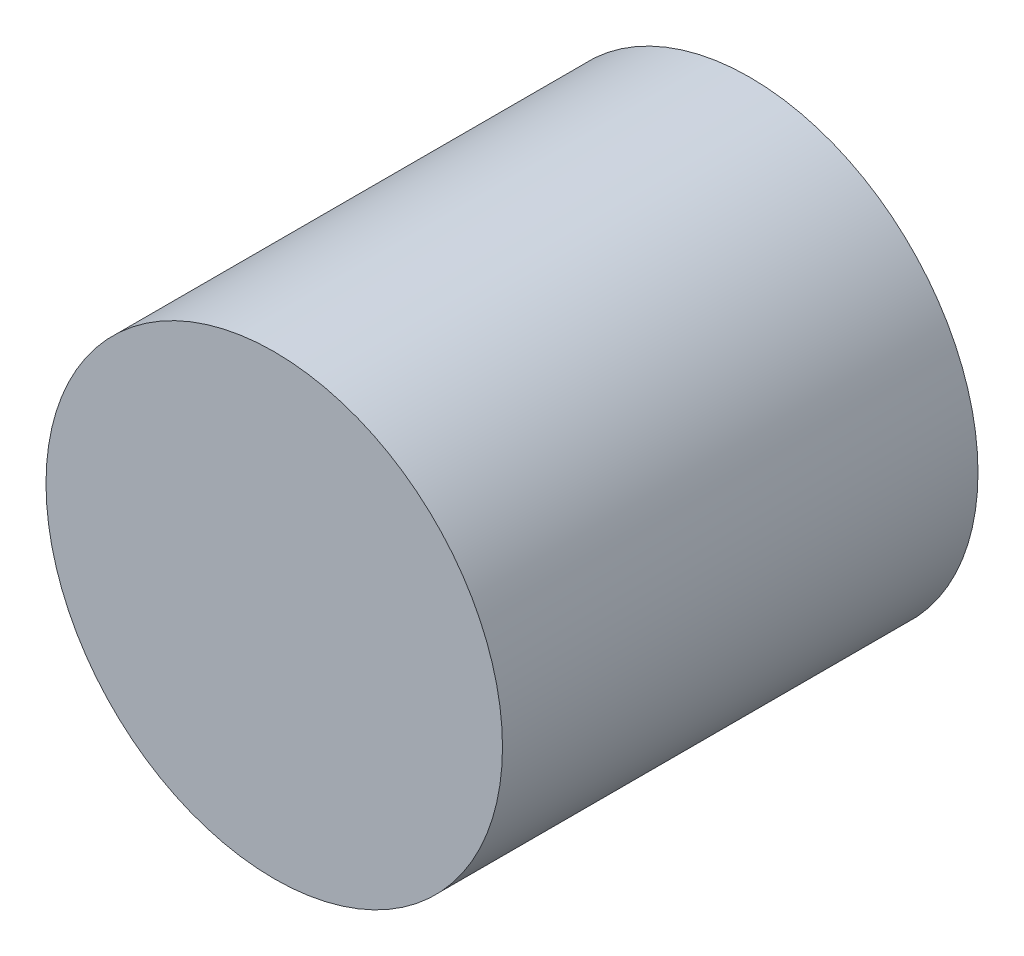
ISO-10303-21;
HEADER;
FILE_DESCRIPTION(('STEP AP214'),'2;1');
FILE_NAME('part.step','',(''),(''),'','','');
FILE_SCHEMA(('AUTOMOTIVE_DESIGN { 1 0 10303 214 1 1 1 1 }'));
ENDSEC;
DATA;
#1=APPLICATION_CONTEXT('core data for automotive mechanical design processes');
#2=APPLICATION_PROTOCOL_DEFINITION('international standard','automotive_design',2000,#1);
#3=PRODUCT_CONTEXT('',#1,'mechanical');
#4=PRODUCT('Part','Part','',(#3));
#5=PRODUCT_RELATED_PRODUCT_CATEGORY('part','',(#4));
#6=PRODUCT_DEFINITION_FORMATION('','',#4);
#7=PRODUCT_DEFINITION_CONTEXT('part definition',#1,'design');
#8=PRODUCT_DEFINITION('design','',#6,#7);
#9=PRODUCT_DEFINITION_SHAPE('','',#8);
#10=(LENGTH_UNIT() NAMED_UNIT(*) SI_UNIT(.MILLI.,.METRE.));
#11=(NAMED_UNIT(*) PLANE_ANGLE_UNIT() SI_UNIT($,.RADIAN.));
#12=(NAMED_UNIT(*) SI_UNIT($,.STERADIAN.) SOLID_ANGLE_UNIT());
#13=UNCERTAINTY_MEASURE_WITH_UNIT(LENGTH_MEASURE(1.E-05),#10,'distance_accuracy_value','');
#14=(GEOMETRIC_REPRESENTATION_CONTEXT(3) GLOBAL_UNCERTAINTY_ASSIGNED_CONTEXT((#13)) GLOBAL_UNIT_ASSIGNED_CONTEXT((#10,
#11,#12)) REPRESENTATION_CONTEXT('',''));
#15=CARTESIAN_POINT('',(0.,0.,0.));
#16=DIRECTION('',(0.,0.,1.));
#17=DIRECTION('',(1.,0.,0.));
#18=AXIS2_PLACEMENT_3D('',#15,#16,#17);
#19=CARTESIAN_POINT('',(0.,0.,50.));
#20=DIRECTION('',(0.,0.,-1.));
#21=DIRECTION('',(-1.,0.,0.));
#22=AXIS2_PLACEMENT_3D('',#19,#20,#21);
#23=CYLINDRICAL_SURFACE('',#22,24.);
#24=CARTESIAN_POINT('',(0.,0.,50.));
#25=DIRECTION('',(0.,0.,1.));
#26=DIRECTION('',(1.,0.,0.));
#27=AXIS2_PLACEMENT_3D('',#24,#25,#26);
#28=CIRCLE('',#27,24.);
#29=CARTESIAN_POINT('',(24.,0.,50.));
#30=VERTEX_POINT('',#29);
#31=EDGE_CURVE('E10',#30,#30,#28,.T.);
#32=ORIENTED_EDGE('',*,*,#31,.F.);
#33=EDGE_LOOP('',(#32));
#34=FACE_BOUND('',#33,.T.);
#35=CARTESIAN_POINT('',(0.,0.,0.));
#36=DIRECTION('',(0.,0.,1.));
#37=DIRECTION('',(1.,0.,0.));
#38=AXIS2_PLACEMENT_3D('',#35,#36,#37);
#39=CIRCLE('',#38,24.);
#40=CARTESIAN_POINT('',(24.,0.,0.));
#41=VERTEX_POINT('',#40);
#42=EDGE_CURVE('E34',#41,#41,#39,.T.);
#43=ORIENTED_EDGE('',*,*,#42,.T.);
#44=EDGE_LOOP('',(#43));
#45=FACE_BOUND('',#44,.T.);
#46=ADVANCED_FACE('F31',(#34,#45),#23,.T.);
#47=CARTESIAN_POINT('',(0.,0.,50.));
#48=DIRECTION('',(0.,0.,1.));
#49=DIRECTION('',(1.,0.,0.));
#50=AXIS2_PLACEMENT_3D('',#47,#48,#49);
#51=PLANE('',#50);
#52=ORIENTED_EDGE('',*,*,#31,.T.);
#53=EDGE_LOOP('',(#52));
#54=FACE_BOUND('',#53,.T.);
#55=ADVANCED_FACE('F60',(#54),#51,.T.);
#56=CARTESIAN_POINT('',(0.,0.,0.));
#57=DIRECTION('',(0.,0.,1.));
#58=DIRECTION('',(1.,0.,0.));
#59=AXIS2_PLACEMENT_3D('',#56,#57,#58);
#60=PLANE('',#59);
#61=CARTESIAN_POINT('',(0.,0.,0.));
#62=DIRECTION('',(0.,0.,-1.));
#63=DIRECTION('',(-1.,0.,0.));
#64=AXIS2_PLACEMENT_3D('',#61,#62,#63);
#65=CIRCLE('',#64,5.);
#66=CARTESIAN_POINT('',(-5.,0.,0.));
#67=VERTEX_POINT('',#66);
#68=EDGE_CURVE('E43',#67,#67,#65,.T.);
#69=ORIENTED_EDGE('',*,*,#68,.F.);
#70=EDGE_LOOP('',(#69));
#71=FACE_BOUND('',#70,.T.);
#72=ORIENTED_EDGE('',*,*,#42,.F.);
#73=EDGE_LOOP('',(#72));
#74=FACE_BOUND('',#73,.T.);
#75=ADVANCED_FACE('F54',(#71,#74),#60,.F.);
#76=CARTESIAN_POINT('',(0.,0.,10.));
#77=DIRECTION('',(0.,0.,-1.));
#78=DIRECTION('',(-1.,0.,0.));
#79=AXIS2_PLACEMENT_3D('',#76,#77,#78);
#80=CYLINDRICAL_SURFACE('',#79,5.);
#81=CARTESIAN_POINT('',(0.,0.,10.));
#82=DIRECTION('',(0.,0.,-1.));
#83=DIRECTION('',(-1.,0.,0.));
#84=AXIS2_PLACEMENT_3D('',#81,#82,#83);
#85=CIRCLE('',#84,5.);
#86=CARTESIAN_POINT('',(-5.,0.,10.));
#87=VERTEX_POINT('',#86);
#88=EDGE_CURVE('E41',#87,#87,#85,.T.);
#89=ORIENTED_EDGE('',*,*,#88,.F.);
#90=EDGE_LOOP('',(#89));
#91=FACE_BOUND('',#90,.T.);
#92=ORIENTED_EDGE('',*,*,#68,.T.);
#93=EDGE_LOOP('',(#92));
#94=FACE_BOUND('',#93,.T.);
#95=ADVANCED_FACE('F51',(#91,#94),#80,.F.);
#96=CARTESIAN_POINT('',(0.,0.,10.));
#97=DIRECTION('',(0.,0.,-1.));
#98=DIRECTION('',(-1.,0.,0.));
#99=AXIS2_PLACEMENT_3D('',#96,#97,#98);
#100=PLANE('',#99);
#101=ORIENTED_EDGE('',*,*,#88,.T.);
#102=EDGE_LOOP('',(#101));
#103=FACE_BOUND('',#102,.T.);
#104=ADVANCED_FACE('F49',(#103),#100,.T.);
#105=CLOSED_SHELL('',(#46,#55,#75,#95,#104));
#106=MANIFOLD_SOLID_BREP('B2',#105);
#107=ADVANCED_BREP_SHAPE_REPRESENTATION('',(#18,#106),#14);
#108=SHAPE_DEFINITION_REPRESENTATION(#9,#107);
ENDSEC;
END-ISO-10303-21;
